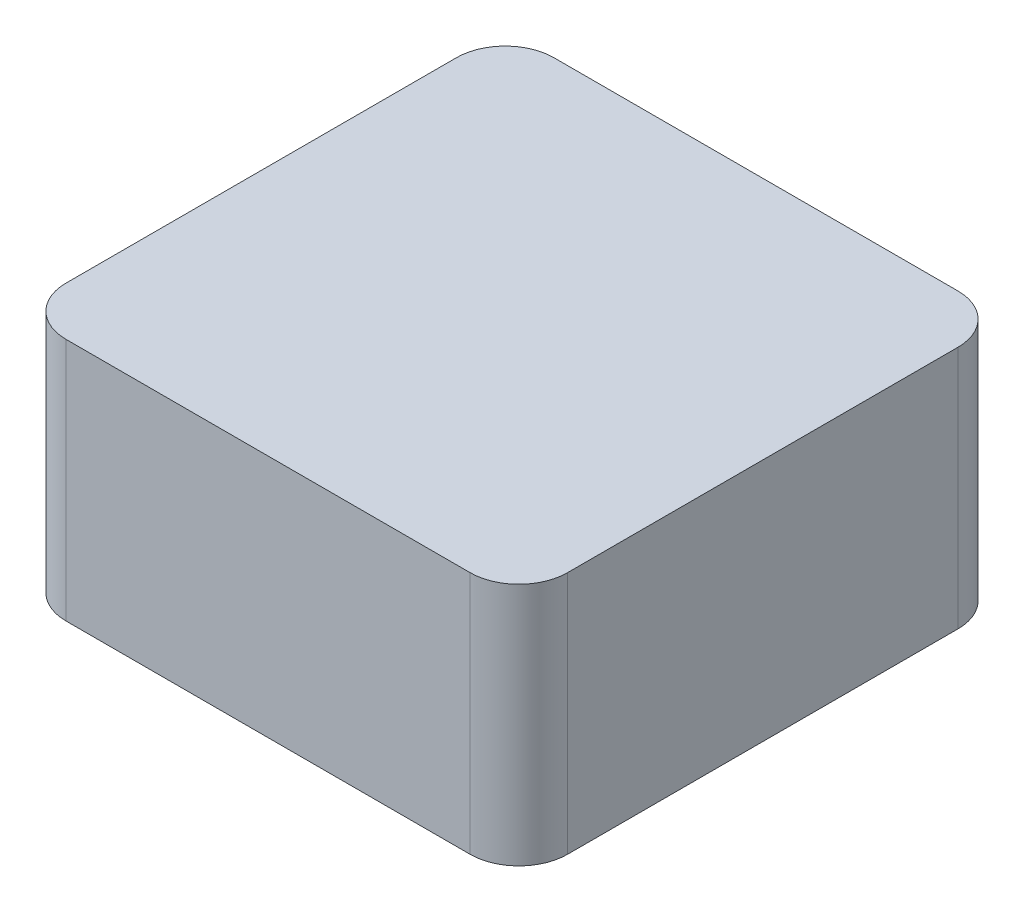
ISO-10303-21;
HEADER;
FILE_DESCRIPTION(('STEP AP214'),'2;1');
FILE_NAME('part.step','',(''),(''),'','','');
FILE_SCHEMA(('AUTOMOTIVE_DESIGN { 1 0 10303 214 1 1 1 1 }'));
ENDSEC;
DATA;
#1=APPLICATION_CONTEXT('core data for automotive mechanical design processes');
#2=APPLICATION_PROTOCOL_DEFINITION('international standard','automotive_design',2000,#1);
#3=PRODUCT_CONTEXT('',#1,'mechanical');
#4=PRODUCT('Part','Part','',(#3));
#5=PRODUCT_RELATED_PRODUCT_CATEGORY('part','',(#4));
#6=PRODUCT_DEFINITION_FORMATION('','',#4);
#7=PRODUCT_DEFINITION_CONTEXT('part definition',#1,'design');
#8=PRODUCT_DEFINITION('design','',#6,#7);
#9=PRODUCT_DEFINITION_SHAPE('','',#8);
#10=(LENGTH_UNIT() NAMED_UNIT(*) SI_UNIT(.MILLI.,.METRE.));
#11=(NAMED_UNIT(*) PLANE_ANGLE_UNIT() SI_UNIT($,.RADIAN.));
#12=(NAMED_UNIT(*) SI_UNIT($,.STERADIAN.) SOLID_ANGLE_UNIT());
#13=UNCERTAINTY_MEASURE_WITH_UNIT(LENGTH_MEASURE(1.E-05),#10,'distance_accuracy_value','');
#14=(GEOMETRIC_REPRESENTATION_CONTEXT(3) GLOBAL_UNCERTAINTY_ASSIGNED_CONTEXT((#13)) GLOBAL_UNIT_ASSIGNED_CONTEXT((#10,
#11,#12)) REPRESENTATION_CONTEXT('',''));
#15=CARTESIAN_POINT('',(0.,0.,0.));
#16=DIRECTION('',(0.,0.,1.));
#17=DIRECTION('',(1.,0.,0.));
#18=AXIS2_PLACEMENT_3D('',#15,#16,#17);
#19=CARTESIAN_POINT('',(-6.5278,6.35,6.35));
#20=DIRECTION('',(1.,0.,0.));
#21=DIRECTION('',(0.,0.,-1.));
#22=AXIS2_PLACEMENT_3D('',#19,#20,#21);
#23=PLANE('',#22);
#24=DIRECTION('',(0.,0.,1.));
#25=VECTOR('',#24,1.);
#26=CARTESIAN_POINT('',(-6.5278,6.35,6.35));
#27=LINE('',#26,#25);
#28=CARTESIAN_POINT('',(-6.5278,6.35,-5.08));
#29=VERTEX_POINT('',#28);
#30=CARTESIAN_POINT('',(-6.5278,6.35,5.08));
#31=VERTEX_POINT('',#30);
#32=EDGE_CURVE('E128',#29,#31,#27,.T.);
#33=ORIENTED_EDGE('',*,*,#32,.F.);
#34=DIRECTION('',(0.,-1.,0.));
#35=VECTOR('',#34,1.);
#36=CARTESIAN_POINT('',(-6.5278,6.35,-5.08));
#37=LINE('',#36,#35);
#38=CARTESIAN_POINT('',(-6.5278,0.,-5.08));
#39=VERTEX_POINT('',#38);
#40=EDGE_CURVE('E11',#29,#39,#37,.T.);
#41=ORIENTED_EDGE('',*,*,#40,.T.);
#42=DIRECTION('',(0.,0.,1.));
#43=VECTOR('',#42,1.);
#44=CARTESIAN_POINT('',(-6.5278,0.,6.35));
#45=LINE('',#44,#43);
#46=CARTESIAN_POINT('',(-6.5278,0.,5.08));
#47=VERTEX_POINT('',#46);
#48=EDGE_CURVE('E130',#39,#47,#45,.T.);
#49=ORIENTED_EDGE('',*,*,#48,.T.);
#50=DIRECTION('',(0.,-1.,0.));
#51=VECTOR('',#50,1.);
#52=CARTESIAN_POINT('',(-6.5278,6.35,5.08));
#53=LINE('',#52,#51);
#54=EDGE_CURVE('E41',#47,#31,#53,.F.);
#55=ORIENTED_EDGE('',*,*,#54,.T.);
#56=EDGE_LOOP('',(#33,#41,#49,#55));
#57=FACE_BOUND('',#56,.T.);
#58=ADVANCED_FACE('F33',(#57),#23,.F.);
#59=CARTESIAN_POINT('',(6.5278,6.35,6.35));
#60=DIRECTION('',(0.,0.,-1.));
#61=DIRECTION('',(-1.,0.,0.));
#62=AXIS2_PLACEMENT_3D('',#59,#60,#61);
#63=PLANE('',#62);
#64=DIRECTION('',(1.,0.,0.));
#65=VECTOR('',#64,1.);
#66=CARTESIAN_POINT('',(6.5278,0.,6.35));
#67=LINE('',#66,#65);
#68=CARTESIAN_POINT('',(-5.2578,0.,6.35));
#69=VERTEX_POINT('',#68);
#70=CARTESIAN_POINT('',(5.2578,0.,6.35));
#71=VERTEX_POINT('',#70);
#72=EDGE_CURVE('E126',#69,#71,#67,.T.);
#73=ORIENTED_EDGE('',*,*,#72,.T.);
#74=DIRECTION('',(0.,-1.,0.));
#75=VECTOR('',#74,1.);
#76=CARTESIAN_POINT('',(5.2578,6.35,6.35));
#77=LINE('',#76,#75);
#78=CARTESIAN_POINT('',(5.2578,6.35,6.35));
#79=VERTEX_POINT('',#78);
#80=EDGE_CURVE('E105',#71,#79,#77,.F.);
#81=ORIENTED_EDGE('',*,*,#80,.T.);
#82=DIRECTION('',(1.,0.,0.));
#83=VECTOR('',#82,1.);
#84=CARTESIAN_POINT('',(6.5278,6.35,6.35));
#85=LINE('',#84,#83);
#86=CARTESIAN_POINT('',(-5.2578,6.35,6.35));
#87=VERTEX_POINT('',#86);
#88=EDGE_CURVE('E166',#87,#79,#85,.T.);
#89=ORIENTED_EDGE('',*,*,#88,.F.);
#90=DIRECTION('',(0.,-1.,0.));
#91=VECTOR('',#90,1.);
#92=CARTESIAN_POINT('',(-5.2578,6.35,6.35));
#93=LINE('',#92,#91);
#94=EDGE_CURVE('E110',#87,#69,#93,.T.);
#95=ORIENTED_EDGE('',*,*,#94,.T.);
#96=EDGE_LOOP('',(#73,#81,#89,#95));
#97=FACE_BOUND('',#96,.T.);
#98=ADVANCED_FACE('F170',(#97),#63,.F.);
#99=CARTESIAN_POINT('',(6.5278,6.35,6.35));
#100=DIRECTION('',(-1.,0.,0.));
#101=DIRECTION('',(0.,0.,1.));
#102=AXIS2_PLACEMENT_3D('',#99,#100,#101);
#103=PLANE('',#102);
#104=DIRECTION('',(0.,0.,-1.));
#105=VECTOR('',#104,1.);
#106=CARTESIAN_POINT('',(6.5278,6.35,6.35));
#107=LINE('',#106,#105);
#108=CARTESIAN_POINT('',(6.5278,6.35,5.08));
#109=VERTEX_POINT('',#108);
#110=CARTESIAN_POINT('',(6.5278,6.35,-5.08));
#111=VERTEX_POINT('',#110);
#112=EDGE_CURVE('E119',#109,#111,#107,.T.);
#113=ORIENTED_EDGE('',*,*,#112,.F.);
#114=DIRECTION('',(0.,-1.,0.));
#115=VECTOR('',#114,1.);
#116=CARTESIAN_POINT('',(6.5278,6.35,5.08));
#117=LINE('',#116,#115);
#118=CARTESIAN_POINT('',(6.5278,0.,5.08));
#119=VERTEX_POINT('',#118);
#120=EDGE_CURVE('E104',#109,#119,#117,.T.);
#121=ORIENTED_EDGE('',*,*,#120,.T.);
#122=DIRECTION('',(0.,0.,-1.));
#123=VECTOR('',#122,1.);
#124=CARTESIAN_POINT('',(6.5278,0.,6.35));
#125=LINE('',#124,#123);
#126=CARTESIAN_POINT('',(6.5278,0.,-5.08));
#127=VERTEX_POINT('',#126);
#128=EDGE_CURVE('E117',#119,#127,#125,.T.);
#129=ORIENTED_EDGE('',*,*,#128,.T.);
#130=DIRECTION('',(0.,-1.,0.));
#131=VECTOR('',#130,1.);
#132=CARTESIAN_POINT('',(6.5278,6.35,-5.08));
#133=LINE('',#132,#131);
#134=EDGE_CURVE('E121',#127,#111,#133,.F.);
#135=ORIENTED_EDGE('',*,*,#134,.T.);
#136=EDGE_LOOP('',(#113,#121,#129,#135));
#137=FACE_BOUND('',#136,.T.);
#138=ADVANCED_FACE('F116',(#137),#103,.F.);
#139=CARTESIAN_POINT('',(6.5278,6.35,-6.35));
#140=DIRECTION('',(0.,0.,1.));
#141=DIRECTION('',(1.,0.,0.));
#142=AXIS2_PLACEMENT_3D('',#139,#140,#141);
#143=PLANE('',#142);
#144=DIRECTION('',(-1.,0.,0.));
#145=VECTOR('',#144,1.);
#146=CARTESIAN_POINT('',(6.5278,6.35,-6.35));
#147=LINE('',#146,#145);
#148=CARTESIAN_POINT('',(5.2578,6.35,-6.35));
#149=VERTEX_POINT('',#148);
#150=CARTESIAN_POINT('',(-5.2578,6.35,-6.35));
#151=VERTEX_POINT('',#150);
#152=EDGE_CURVE('E134',#149,#151,#147,.T.);
#153=ORIENTED_EDGE('',*,*,#152,.F.);
#154=DIRECTION('',(0.,-1.,0.));
#155=VECTOR('',#154,1.);
#156=CARTESIAN_POINT('',(5.2578,6.35,-6.35));
#157=LINE('',#156,#155);
#158=CARTESIAN_POINT('',(5.2578,0.,-6.35));
#159=VERTEX_POINT('',#158);
#160=EDGE_CURVE('E151',#149,#159,#157,.T.);
#161=ORIENTED_EDGE('',*,*,#160,.T.);
#162=DIRECTION('',(-1.,0.,0.));
#163=VECTOR('',#162,1.);
#164=CARTESIAN_POINT('',(6.5278,0.,-6.35));
#165=LINE('',#164,#163);
#166=CARTESIAN_POINT('',(-5.2578,0.,-6.35));
#167=VERTEX_POINT('',#166);
#168=EDGE_CURVE('E125',#159,#167,#165,.T.);
#169=ORIENTED_EDGE('',*,*,#168,.T.);
#170=DIRECTION('',(0.,-1.,0.));
#171=VECTOR('',#170,1.);
#172=CARTESIAN_POINT('',(-5.2578,6.35,-6.35));
#173=LINE('',#172,#171);
#174=EDGE_CURVE('E48',#167,#151,#173,.F.);
#175=ORIENTED_EDGE('',*,*,#174,.T.);
#176=EDGE_LOOP('',(#153,#161,#169,#175));
#177=FACE_BOUND('',#176,.T.);
#178=ADVANCED_FACE('F177',(#177),#143,.F.);
#179=CARTESIAN_POINT('',(0.,6.35,0.));
#180=DIRECTION('',(0.,1.,0.));
#181=DIRECTION('',(0.,0.,1.));
#182=AXIS2_PLACEMENT_3D('',#179,#180,#181);
#183=PLANE('',#182);
#184=ORIENTED_EDGE('',*,*,#88,.T.);
#185=CARTESIAN_POINT('',(5.2578,6.35,5.08));
#186=DIRECTION('',(0.,1.,0.));
#187=DIRECTION('',(0.,0.,1.));
#188=AXIS2_PLACEMENT_3D('',#185,#186,#187);
#189=CIRCLE('',#188,1.27);
#190=EDGE_CURVE('E148',#79,#109,#189,.T.);
#191=ORIENTED_EDGE('',*,*,#190,.T.);
#192=ORIENTED_EDGE('',*,*,#112,.T.);
#193=CARTESIAN_POINT('',(5.2578,6.35,-5.08));
#194=DIRECTION('',(0.,1.,0.));
#195=DIRECTION('',(0.,0.,1.));
#196=AXIS2_PLACEMENT_3D('',#193,#194,#195);
#197=CIRCLE('',#196,1.27);
#198=EDGE_CURVE('E55',#111,#149,#197,.T.);
#199=ORIENTED_EDGE('',*,*,#198,.T.);
#200=ORIENTED_EDGE('',*,*,#152,.T.);
#201=CARTESIAN_POINT('',(-5.2578,6.35,-5.08));
#202=DIRECTION('',(0.,1.,0.));
#203=DIRECTION('',(0.,0.,1.));
#204=AXIS2_PLACEMENT_3D('',#201,#202,#203);
#205=CIRCLE('',#204,1.27);
#206=EDGE_CURVE('E145',#151,#29,#205,.T.);
#207=ORIENTED_EDGE('',*,*,#206,.T.);
#208=ORIENTED_EDGE('',*,*,#32,.T.);
#209=CARTESIAN_POINT('',(-5.2578,6.35,5.08));
#210=DIRECTION('',(0.,1.,0.));
#211=DIRECTION('',(0.,0.,1.));
#212=AXIS2_PLACEMENT_3D('',#209,#210,#211);
#213=CIRCLE('',#212,1.27);
#214=EDGE_CURVE('E143',#31,#87,#213,.T.);
#215=ORIENTED_EDGE('',*,*,#214,.T.);
#216=EDGE_LOOP('',(#184,#191,#192,#199,#200,#207,#208,#215));
#217=FACE_BOUND('',#216,.T.);
#218=ADVANCED_FACE('F163',(#217),#183,.T.);
#219=CARTESIAN_POINT('',(0.,0.,0.));
#220=DIRECTION('',(0.,1.,0.));
#221=DIRECTION('',(0.,0.,1.));
#222=AXIS2_PLACEMENT_3D('',#219,#220,#221);
#223=PLANE('',#222);
#224=ORIENTED_EDGE('',*,*,#128,.F.);
#225=CARTESIAN_POINT('',(5.2578,0.,5.08));
#226=DIRECTION('',(0.,1.,0.));
#227=DIRECTION('',(0.,0.,1.));
#228=AXIS2_PLACEMENT_3D('',#225,#226,#227);
#229=CIRCLE('',#228,1.27);
#230=EDGE_CURVE('E100',#119,#71,#229,.F.);
#231=ORIENTED_EDGE('',*,*,#230,.T.);
#232=ORIENTED_EDGE('',*,*,#72,.F.);
#233=CARTESIAN_POINT('',(-5.2578,0.,5.08));
#234=DIRECTION('',(0.,1.,0.));
#235=DIRECTION('',(0.,0.,1.));
#236=AXIS2_PLACEMENT_3D('',#233,#234,#235);
#237=CIRCLE('',#236,1.27);
#238=EDGE_CURVE('E120',#69,#47,#237,.F.);
#239=ORIENTED_EDGE('',*,*,#238,.T.);
#240=ORIENTED_EDGE('',*,*,#48,.F.);
#241=CARTESIAN_POINT('',(-5.2578,0.,-5.08));
#242=DIRECTION('',(0.,1.,0.));
#243=DIRECTION('',(0.,0.,1.));
#244=AXIS2_PLACEMENT_3D('',#241,#242,#243);
#245=CIRCLE('',#244,1.27);
#246=EDGE_CURVE('E137',#39,#167,#245,.F.);
#247=ORIENTED_EDGE('',*,*,#246,.T.);
#248=ORIENTED_EDGE('',*,*,#168,.F.);
#249=CARTESIAN_POINT('',(5.2578,0.,-5.08));
#250=DIRECTION('',(0.,1.,0.));
#251=DIRECTION('',(0.,0.,1.));
#252=AXIS2_PLACEMENT_3D('',#249,#250,#251);
#253=CIRCLE('',#252,1.27);
#254=EDGE_CURVE('E111',#159,#127,#253,.F.);
#255=ORIENTED_EDGE('',*,*,#254,.T.);
#256=EDGE_LOOP('',(#224,#231,#232,#239,#240,#247,#248,#255));
#257=FACE_BOUND('',#256,.T.);
#258=ADVANCED_FACE('F123',(#257),#223,.F.);
#259=CARTESIAN_POINT('',(5.2578,6.35,5.08));
#260=DIRECTION('',(0.,-1.,0.));
#261=DIRECTION('',(0.,0.,-1.));
#262=AXIS2_PLACEMENT_3D('',#259,#260,#261);
#263=CYLINDRICAL_SURFACE('',#262,1.27);
#264=ORIENTED_EDGE('',*,*,#190,.F.);
#265=ORIENTED_EDGE('',*,*,#80,.F.);
#266=ORIENTED_EDGE('',*,*,#230,.F.);
#267=ORIENTED_EDGE('',*,*,#120,.F.);
#268=EDGE_LOOP('',(#264,#265,#266,#267));
#269=FACE_BOUND('',#268,.T.);
#270=ADVANCED_FACE('F103',(#269),#263,.T.);
#271=CARTESIAN_POINT('',(5.2578,6.35,-5.08));
#272=DIRECTION('',(0.,-1.,0.));
#273=DIRECTION('',(0.,0.,-1.));
#274=AXIS2_PLACEMENT_3D('',#271,#272,#273);
#275=CYLINDRICAL_SURFACE('',#274,1.27);
#276=ORIENTED_EDGE('',*,*,#198,.F.);
#277=ORIENTED_EDGE('',*,*,#134,.F.);
#278=ORIENTED_EDGE('',*,*,#254,.F.);
#279=ORIENTED_EDGE('',*,*,#160,.F.);
#280=EDGE_LOOP('',(#276,#277,#278,#279));
#281=FACE_BOUND('',#280,.T.);
#282=ADVANCED_FACE('F176',(#281),#275,.T.);
#283=CARTESIAN_POINT('',(-5.2578,6.35,-5.08));
#284=DIRECTION('',(0.,-1.,0.));
#285=DIRECTION('',(0.,0.,-1.));
#286=AXIS2_PLACEMENT_3D('',#283,#284,#285);
#287=CYLINDRICAL_SURFACE('',#286,1.27);
#288=ORIENTED_EDGE('',*,*,#206,.F.);
#289=ORIENTED_EDGE('',*,*,#174,.F.);
#290=ORIENTED_EDGE('',*,*,#246,.F.);
#291=ORIENTED_EDGE('',*,*,#40,.F.);
#292=EDGE_LOOP('',(#288,#289,#290,#291));
#293=FACE_BOUND('',#292,.T.);
#294=ADVANCED_FACE('F179',(#293),#287,.T.);
#295=CARTESIAN_POINT('',(-5.2578,6.35,5.08));
#296=DIRECTION('',(0.,-1.,0.));
#297=DIRECTION('',(0.,0.,-1.));
#298=AXIS2_PLACEMENT_3D('',#295,#296,#297);
#299=CYLINDRICAL_SURFACE('',#298,1.27);
#300=ORIENTED_EDGE('',*,*,#214,.F.);
#301=ORIENTED_EDGE('',*,*,#54,.F.);
#302=ORIENTED_EDGE('',*,*,#238,.F.);
#303=ORIENTED_EDGE('',*,*,#94,.F.);
#304=EDGE_LOOP('',(#300,#301,#302,#303));
#305=FACE_BOUND('',#304,.T.);
#306=ADVANCED_FACE('F35',(#305),#299,.T.);
#307=CLOSED_SHELL('',(#58,#98,#138,#178,#218,#258,#270,#282,#294,#306));
#308=MANIFOLD_SOLID_BREP('B2',#307);
#309=ADVANCED_BREP_SHAPE_REPRESENTATION('',(#18,#308),#14);
#310=SHAPE_DEFINITION_REPRESENTATION(#9,#309);
ENDSEC;
END-ISO-10303-21;
